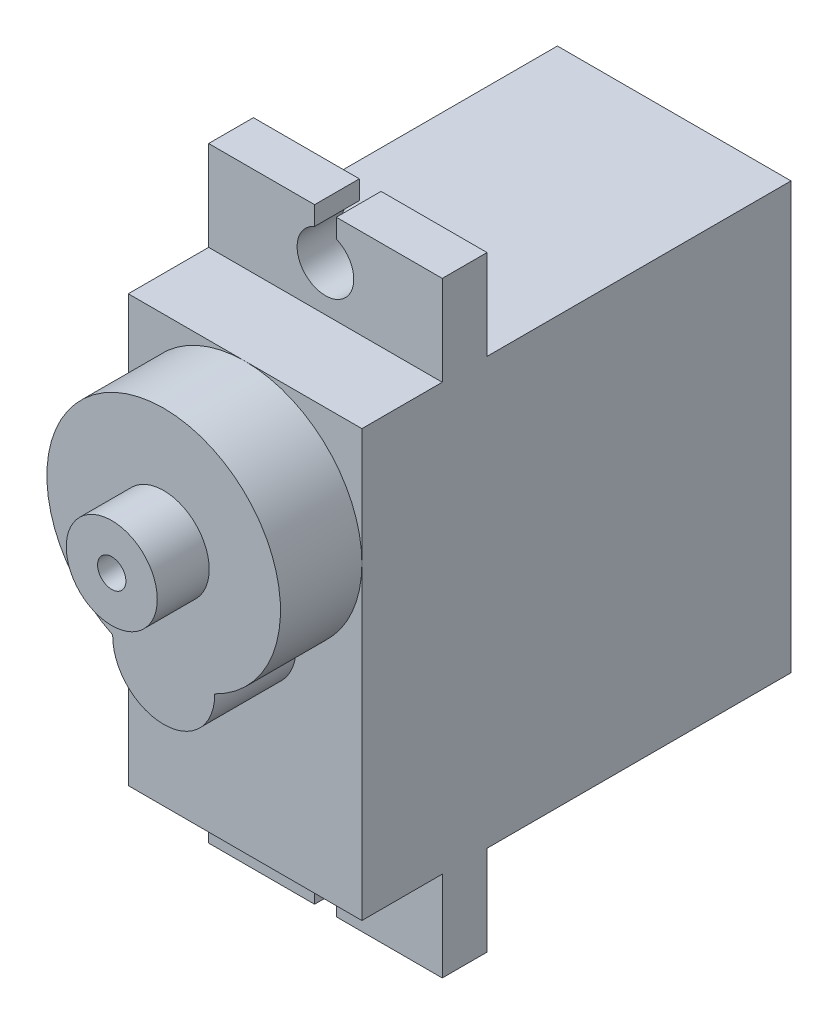
ISO-10303-21;
HEADER;
FILE_DESCRIPTION(('STEP AP214'),'2;1');
FILE_NAME('part.step','',(''),(''),'','','');
FILE_SCHEMA(('AUTOMOTIVE_DESIGN { 1 0 10303 214 1 1 1 1 }'));
ENDSEC;
DATA;
#1=APPLICATION_CONTEXT('core data for automotive mechanical design processes');
#2=APPLICATION_PROTOCOL_DEFINITION('international standard','automotive_design',2000,#1);
#3=PRODUCT_CONTEXT('',#1,'mechanical');
#4=PRODUCT('Part','Part','',(#3));
#5=PRODUCT_RELATED_PRODUCT_CATEGORY('part','',(#4));
#6=PRODUCT_DEFINITION_FORMATION('','',#4);
#7=PRODUCT_DEFINITION_CONTEXT('part definition',#1,'design');
#8=PRODUCT_DEFINITION('design','',#6,#7);
#9=PRODUCT_DEFINITION_SHAPE('','',#8);
#10=(LENGTH_UNIT() NAMED_UNIT(*) SI_UNIT(.MILLI.,.METRE.));
#11=(NAMED_UNIT(*) PLANE_ANGLE_UNIT() SI_UNIT($,.RADIAN.));
#12=(NAMED_UNIT(*) SI_UNIT($,.STERADIAN.) SOLID_ANGLE_UNIT());
#13=UNCERTAINTY_MEASURE_WITH_UNIT(LENGTH_MEASURE(1.E-05),#10,'distance_accuracy_value','');
#14=(GEOMETRIC_REPRESENTATION_CONTEXT(3) GLOBAL_UNCERTAINTY_ASSIGNED_CONTEXT((#13)) GLOBAL_UNIT_ASSIGNED_CONTEXT((#10,
#11,#12)) REPRESENTATION_CONTEXT('',''));
#15=CARTESIAN_POINT('',(0.,0.,0.));
#16=DIRECTION('',(0.,0.,1.));
#17=DIRECTION('',(1.,0.,0.));
#18=AXIS2_PLACEMENT_3D('',#15,#16,#17);
#19=CARTESIAN_POINT('',(0.,0.,11.36015));
#20=DIRECTION('',(0.,0.,-1.));
#21=DIRECTION('',(-1.,0.,0.));
#22=AXIS2_PLACEMENT_3D('',#19,#20,#21);
#23=PLANE('',#22);
#24=CARTESIAN_POINT('',(0.,5.0927,11.36015));
#25=DIRECTION('',(0.,0.,1.));
#26=DIRECTION('',(1.,0.,0.));
#27=AXIS2_PLACEMENT_3D('',#24,#25,#26);
#28=CIRCLE('',#27,6.1849);
#29=CARTESIAN_POINT('',(2.7,-0.471739595323143,11.36015));
#30=VERTEX_POINT('',#29);
#31=CARTESIAN_POINT('',(6.1849,5.0927,11.36015));
#32=VERTEX_POINT('',#31);
#33=EDGE_CURVE('E59',#30,#32,#28,.T.);
#34=ORIENTED_EDGE('',*,*,#33,.F.);
#35=DIRECTION('',(0.,1.,0.));
#36=VECTOR('',#35,1.);
#37=CARTESIAN_POINT('',(2.7,-0.522399999999999,11.36015));
#38=LINE('',#37,#36);
#39=CARTESIAN_POINT('',(2.7,-0.522399999999999,11.36015));
#40=VERTEX_POINT('',#39);
#41=EDGE_CURVE('E64',#40,#30,#38,.T.);
#42=ORIENTED_EDGE('',*,*,#41,.F.);
#43=CARTESIAN_POINT('',(0.,-0.5224,11.36015));
#44=DIRECTION('',(0.,0.,1.));
#45=DIRECTION('',(-1.,0.,0.));
#46=AXIS2_PLACEMENT_3D('',#43,#44,#45);
#47=CIRCLE('',#46,2.7);
#48=CARTESIAN_POINT('',(-2.7,-0.5224,11.36015));
#49=VERTEX_POINT('',#48);
#50=EDGE_CURVE('E539',#49,#40,#47,.T.);
#51=ORIENTED_EDGE('',*,*,#50,.F.);
#52=DIRECTION('',(0.,-1.,0.));
#53=VECTOR('',#52,1.);
#54=CARTESIAN_POINT('',(-2.7,-0.5224,11.36015));
#55=LINE('',#54,#53);
#56=CARTESIAN_POINT('',(-2.7,-0.471739595323143,11.36015));
#57=VERTEX_POINT('',#56);
#58=EDGE_CURVE('E541',#57,#49,#55,.T.);
#59=ORIENTED_EDGE('',*,*,#58,.F.);
#60=CARTESIAN_POINT('',(-6.1849,5.0927,11.36015));
#61=VERTEX_POINT('',#60);
#62=EDGE_CURVE('E287',#61,#57,#28,.T.);
#63=ORIENTED_EDGE('',*,*,#62,.F.);
#64=DIRECTION('',(0.,-1.,0.));
#65=VECTOR('',#64,1.);
#66=CARTESIAN_POINT('',(-6.1849,-11.2776,11.36015));
#67=LINE('',#66,#65);
#68=CARTESIAN_POINT('',(-6.1849,-11.2776,11.36015));
#69=VERTEX_POINT('',#68);
#70=EDGE_CURVE('E462',#61,#69,#67,.T.);
#71=ORIENTED_EDGE('',*,*,#70,.T.);
#72=DIRECTION('',(1.,0.,0.));
#73=VECTOR('',#72,1.);
#74=CARTESIAN_POINT('',(-6.1849,-11.2776,11.36015));
#75=LINE('',#74,#73);
#76=CARTESIAN_POINT('',(6.1849,-11.2776,11.36015));
#77=VERTEX_POINT('',#76);
#78=EDGE_CURVE('E467',#69,#77,#75,.T.);
#79=ORIENTED_EDGE('',*,*,#78,.T.);
#80=DIRECTION('',(0.,1.,0.));
#81=VECTOR('',#80,1.);
#82=CARTESIAN_POINT('',(6.1849,-11.2776,11.36015));
#83=LINE('',#82,#81);
#84=EDGE_CURVE('E453',#77,#32,#83,.T.);
#85=ORIENTED_EDGE('',*,*,#84,.T.);
#86=EDGE_LOOP('',(#34,#42,#51,#59,#63,#71,#79,#85));
#87=FACE_BOUND('',#86,.T.);
#88=ADVANCED_FACE('F40',(#87),#23,.F.);
#89=CARTESIAN_POINT('',(0.,11.2776,11.36015));
#90=VERTEX_POINT('',#89);
#91=EDGE_CURVE('E49',#32,#90,#28,.T.);
#92=ORIENTED_EDGE('',*,*,#91,.F.);
#93=CARTESIAN_POINT('',(6.1849,11.2776,11.36015));
#94=VERTEX_POINT('',#93);
#95=EDGE_CURVE('E457',#32,#94,#83,.T.);
#96=ORIENTED_EDGE('',*,*,#95,.T.);
#97=DIRECTION('',(-1.,0.,0.));
#98=VECTOR('',#97,1.);
#99=CARTESIAN_POINT('',(-6.1849,11.2776,11.36015));
#100=LINE('',#99,#98);
#101=EDGE_CURVE('E458',#94,#90,#100,.T.);
#102=ORIENTED_EDGE('',*,*,#101,.T.);
#103=EDGE_LOOP('',(#92,#96,#102));
#104=FACE_BOUND('',#103,.T.);
#105=ADVANCED_FACE('F585',(#104),#23,.F.);
#106=EDGE_CURVE('E507',#90,#61,#28,.T.);
#107=ORIENTED_EDGE('',*,*,#106,.F.);
#108=CARTESIAN_POINT('',(-6.1849,11.2776,11.36015));
#109=VERTEX_POINT('',#108);
#110=EDGE_CURVE('E456',#90,#109,#100,.T.);
#111=ORIENTED_EDGE('',*,*,#110,.T.);
#112=EDGE_CURVE('E463',#109,#61,#67,.T.);
#113=ORIENTED_EDGE('',*,*,#112,.T.);
#114=EDGE_LOOP('',(#107,#111,#113));
#115=FACE_BOUND('',#114,.T.);
#116=ADVANCED_FACE('F587',(#115),#23,.F.);
#117=CARTESIAN_POINT('',(-6.1849,-11.2776,11.36015));
#118=DIRECTION('',(0.,1.,0.));
#119=DIRECTION('',(0.,0.,1.));
#120=AXIS2_PLACEMENT_3D('',#117,#118,#119);
#121=PLANE('',#120);
#122=DIRECTION('',(1.,0.,0.));
#123=VECTOR('',#122,1.);
#124=CARTESIAN_POINT('',(-6.1849,-11.2776,4.73565));
#125=LINE('',#124,#123);
#126=CARTESIAN_POINT('',(-6.1849,-11.2776,4.73565));
#127=VERTEX_POINT('',#126);
#128=CARTESIAN_POINT('',(6.1849,-11.2776,4.73565));
#129=VERTEX_POINT('',#128);
#130=EDGE_CURVE('E324',#127,#129,#125,.T.);
#131=ORIENTED_EDGE('',*,*,#130,.F.);
#132=DIRECTION('',(0.,0.,-1.));
#133=VECTOR('',#132,1.);
#134=CARTESIAN_POINT('',(-6.1849,-11.2776,11.36015));
#135=LINE('',#134,#133);
#136=CARTESIAN_POINT('',(-6.1849,-11.2776,-11.36015));
#137=VERTEX_POINT('',#136);
#138=EDGE_CURVE('E490',#127,#137,#135,.T.);
#139=ORIENTED_EDGE('',*,*,#138,.T.);
#140=DIRECTION('',(1.,0.,0.));
#141=VECTOR('',#140,1.);
#142=CARTESIAN_POINT('',(-6.1849,-11.2776,-11.36015));
#143=LINE('',#142,#141);
#144=CARTESIAN_POINT('',(6.1849,-11.2776,-11.36015));
#145=VERTEX_POINT('',#144);
#146=EDGE_CURVE('E482',#137,#145,#143,.T.);
#147=ORIENTED_EDGE('',*,*,#146,.T.);
#148=DIRECTION('',(0.,0.,-1.));
#149=VECTOR('',#148,1.);
#150=CARTESIAN_POINT('',(6.1849,-11.2776,11.36015));
#151=LINE('',#150,#149);
#152=EDGE_CURVE('E470',#129,#145,#151,.T.);
#153=ORIENTED_EDGE('',*,*,#152,.F.);
#154=EDGE_LOOP('',(#131,#139,#147,#153));
#155=FACE_BOUND('',#154,.T.);
#156=ADVANCED_FACE('F525',(#155),#121,.F.);
#157=CARTESIAN_POINT('',(-6.1849,11.2776,11.36015));
#158=DIRECTION('',(0.,-1.,0.));
#159=DIRECTION('',(0.,0.,-1.));
#160=AXIS2_PLACEMENT_3D('',#157,#158,#159);
#161=PLANE('',#160);
#162=DIRECTION('',(1.,0.,0.));
#163=VECTOR('',#162,1.);
#164=CARTESIAN_POINT('',(-6.1849,11.2776,7.10565));
#165=LINE('',#164,#163);
#166=CARTESIAN_POINT('',(-6.1849,11.2776,7.10565));
#167=VERTEX_POINT('',#166);
#168=CARTESIAN_POINT('',(6.1849,11.2776,7.10565));
#169=VERTEX_POINT('',#168);
#170=EDGE_CURVE('E408',#167,#169,#165,.T.);
#171=ORIENTED_EDGE('',*,*,#170,.F.);
#172=DIRECTION('',(0.,0.,-1.));
#173=VECTOR('',#172,1.);
#174=CARTESIAN_POINT('',(-6.1849,11.2776,11.36015));
#175=LINE('',#174,#173);
#176=EDGE_CURVE('E495',#109,#167,#175,.T.);
#177=ORIENTED_EDGE('',*,*,#176,.F.);
#178=ORIENTED_EDGE('',*,*,#110,.F.);
#179=ORIENTED_EDGE('',*,*,#101,.F.);
#180=DIRECTION('',(0.,0.,-1.));
#181=VECTOR('',#180,1.);
#182=CARTESIAN_POINT('',(6.1849,11.2776,11.36015));
#183=LINE('',#182,#181);
#184=EDGE_CURVE('E499',#94,#169,#183,.T.);
#185=ORIENTED_EDGE('',*,*,#184,.T.);
#186=EDGE_LOOP('',(#171,#177,#178,#179,#185));
#187=FACE_BOUND('',#186,.T.);
#188=ADVANCED_FACE('F599',(#187),#161,.F.);
#189=CARTESIAN_POINT('',(6.1849,-11.2776,11.36015));
#190=DIRECTION('',(-1.,0.,0.));
#191=DIRECTION('',(0.,0.,1.));
#192=AXIS2_PLACEMENT_3D('',#189,#190,#191);
#193=PLANE('',#192);
#194=DIRECTION('',(0.,1.,0.));
#195=VECTOR('',#194,1.);
#196=CARTESIAN_POINT('',(6.1849,-11.2776,-11.36015));
#197=LINE('',#196,#195);
#198=CARTESIAN_POINT('',(6.1849,11.2776,-11.36015));
#199=VERTEX_POINT('',#198);
#200=EDGE_CURVE('E438',#145,#199,#197,.T.);
#201=ORIENTED_EDGE('',*,*,#200,.T.);
#202=CARTESIAN_POINT('',(6.1849,11.2776,4.73565));
#203=VERTEX_POINT('',#202);
#204=EDGE_CURVE('E498',#203,#199,#183,.T.);
#205=ORIENTED_EDGE('',*,*,#204,.F.);
#206=DIRECTION('',(0.,1.,0.));
#207=VECTOR('',#206,1.);
#208=CARTESIAN_POINT('',(6.1849,11.2776,4.73565));
#209=LINE('',#208,#207);
#210=CARTESIAN_POINT('',(6.1849,16.0401,4.73565));
#211=VERTEX_POINT('',#210);
#212=EDGE_CURVE('E381',#203,#211,#209,.T.);
#213=ORIENTED_EDGE('',*,*,#212,.T.);
#214=DIRECTION('',(0.,0.,1.));
#215=VECTOR('',#214,1.);
#216=CARTESIAN_POINT('',(6.1849,16.0401,4.73565));
#217=LINE('',#216,#215);
#218=CARTESIAN_POINT('',(6.1849,16.0401,7.10565));
#219=VERTEX_POINT('',#218);
#220=EDGE_CURVE('E405',#211,#219,#217,.T.);
#221=ORIENTED_EDGE('',*,*,#220,.T.);
#222=DIRECTION('',(0.,1.,0.));
#223=VECTOR('',#222,1.);
#224=CARTESIAN_POINT('',(6.1849,11.2776,7.10565));
#225=LINE('',#224,#223);
#226=EDGE_CURVE('E412',#169,#219,#225,.T.);
#227=ORIENTED_EDGE('',*,*,#226,.F.);
#228=ORIENTED_EDGE('',*,*,#184,.F.);
#229=ORIENTED_EDGE('',*,*,#95,.F.);
#230=ORIENTED_EDGE('',*,*,#84,.F.);
#231=CARTESIAN_POINT('',(6.1849,-11.2776,7.10565));
#232=VERTEX_POINT('',#231);
#233=EDGE_CURVE('E486',#77,#232,#151,.T.);
#234=ORIENTED_EDGE('',*,*,#233,.T.);
#235=DIRECTION('',(0.,-1.,0.));
#236=VECTOR('',#235,1.);
#237=CARTESIAN_POINT('',(6.1849,-11.2776,7.10565));
#238=LINE('',#237,#236);
#239=CARTESIAN_POINT('',(6.1849,-16.0401,7.10565));
#240=VERTEX_POINT('',#239);
#241=EDGE_CURVE('E343',#232,#240,#238,.T.);
#242=ORIENTED_EDGE('',*,*,#241,.T.);
#243=DIRECTION('',(0.,0.,1.));
#244=VECTOR('',#243,1.);
#245=CARTESIAN_POINT('',(6.1849,-16.0401,4.73565));
#246=LINE('',#245,#244);
#247=CARTESIAN_POINT('',(6.1849,-16.0401,4.73565));
#248=VERTEX_POINT('',#247);
#249=EDGE_CURVE('E348',#248,#240,#246,.T.);
#250=ORIENTED_EDGE('',*,*,#249,.F.);
#251=DIRECTION('',(0.,-1.,0.));
#252=VECTOR('',#251,1.);
#253=CARTESIAN_POINT('',(6.1849,-11.2776,4.73565));
#254=LINE('',#253,#252);
#255=EDGE_CURVE('E321',#129,#248,#254,.T.);
#256=ORIENTED_EDGE('',*,*,#255,.F.);
#257=ORIENTED_EDGE('',*,*,#152,.T.);
#258=EDGE_LOOP('',(#201,#205,#213,#221,#227,#228,#229,#230,#234,#242,#250,#256,#257));
#259=FACE_BOUND('',#258,.T.);
#260=ADVANCED_FACE('F42',(#259),#193,.F.);
#261=CARTESIAN_POINT('',(-6.1849,11.2776,4.73565));
#262=VERTEX_POINT('',#261);
#263=CARTESIAN_POINT('',(-6.1849,11.2776,-11.36015));
#264=VERTEX_POINT('',#263);
#265=EDGE_CURVE('E494',#262,#264,#175,.T.);
#266=ORIENTED_EDGE('',*,*,#265,.F.);
#267=DIRECTION('',(1.,0.,0.));
#268=VECTOR('',#267,1.);
#269=CARTESIAN_POINT('',(-6.1849,11.2776,4.73565));
#270=LINE('',#269,#268);
#271=EDGE_CURVE('E376',#262,#203,#270,.T.);
#272=ORIENTED_EDGE('',*,*,#271,.T.);
#273=ORIENTED_EDGE('',*,*,#204,.T.);
#274=DIRECTION('',(-1.,0.,0.));
#275=VECTOR('',#274,1.);
#276=CARTESIAN_POINT('',(-6.1849,11.2776,-11.36015));
#277=LINE('',#276,#275);
#278=EDGE_CURVE('E474',#199,#264,#277,.T.);
#279=ORIENTED_EDGE('',*,*,#278,.T.);
#280=EDGE_LOOP('',(#266,#272,#273,#279));
#281=FACE_BOUND('',#280,.T.);
#282=ADVANCED_FACE('F514',(#281),#161,.F.);
#283=CARTESIAN_POINT('',(-6.1849,-11.2776,11.36015));
#284=DIRECTION('',(1.,0.,0.));
#285=DIRECTION('',(0.,0.,-1.));
#286=AXIS2_PLACEMENT_3D('',#283,#284,#285);
#287=PLANE('',#286);
#288=DIRECTION('',(0.,-1.,0.));
#289=VECTOR('',#288,1.);
#290=CARTESIAN_POINT('',(-6.1849,-11.2776,-11.36015));
#291=LINE('',#290,#289);
#292=EDGE_CURVE('E478',#264,#137,#291,.T.);
#293=ORIENTED_EDGE('',*,*,#292,.T.);
#294=ORIENTED_EDGE('',*,*,#138,.F.);
#295=DIRECTION('',(0.,1.,0.));
#296=VECTOR('',#295,1.);
#297=CARTESIAN_POINT('',(-6.1849,-16.0401,4.73565));
#298=LINE('',#297,#296);
#299=CARTESIAN_POINT('',(-6.1849,-16.0401,4.73565));
#300=VERTEX_POINT('',#299);
#301=EDGE_CURVE('E301',#300,#127,#298,.T.);
#302=ORIENTED_EDGE('',*,*,#301,.F.);
#303=DIRECTION('',(0.,0.,1.));
#304=VECTOR('',#303,1.);
#305=CARTESIAN_POINT('',(-6.1849,-16.0401,4.73565));
#306=LINE('',#305,#304);
#307=CARTESIAN_POINT('',(-6.1849,-16.0401,7.10565));
#308=VERTEX_POINT('',#307);
#309=EDGE_CURVE('E327',#300,#308,#306,.T.);
#310=ORIENTED_EDGE('',*,*,#309,.T.);
#311=DIRECTION('',(0.,1.,0.));
#312=VECTOR('',#311,1.);
#313=CARTESIAN_POINT('',(-6.1849,-16.0401,7.10565));
#314=LINE('',#313,#312);
#315=CARTESIAN_POINT('',(-6.1849,-11.2776,7.10565));
#316=VERTEX_POINT('',#315);
#317=EDGE_CURVE('E289',#308,#316,#314,.T.);
#318=ORIENTED_EDGE('',*,*,#317,.T.);
#319=EDGE_CURVE('E491',#69,#316,#135,.T.);
#320=ORIENTED_EDGE('',*,*,#319,.F.);
#321=ORIENTED_EDGE('',*,*,#70,.F.);
#322=ORIENTED_EDGE('',*,*,#112,.F.);
#323=ORIENTED_EDGE('',*,*,#176,.T.);
#324=DIRECTION('',(0.,-1.,0.));
#325=VECTOR('',#324,1.);
#326=CARTESIAN_POINT('',(-6.1849,16.0401,7.10565));
#327=LINE('',#326,#325);
#328=CARTESIAN_POINT('',(-6.1849,16.0401,7.10565));
#329=VERTEX_POINT('',#328);
#330=EDGE_CURVE('E352',#329,#167,#327,.T.);
#331=ORIENTED_EDGE('',*,*,#330,.F.);
#332=DIRECTION('',(0.,0.,1.));
#333=VECTOR('',#332,1.);
#334=CARTESIAN_POINT('',(-6.1849,16.0401,4.73565));
#335=LINE('',#334,#333);
#336=CARTESIAN_POINT('',(-6.1849,16.0401,4.73565));
#337=VERTEX_POINT('',#336);
#338=EDGE_CURVE('E435',#337,#329,#335,.T.);
#339=ORIENTED_EDGE('',*,*,#338,.F.);
#340=DIRECTION('',(0.,-1.,0.));
#341=VECTOR('',#340,1.);
#342=CARTESIAN_POINT('',(-6.1849,16.0401,4.73565));
#343=LINE('',#342,#341);
#344=EDGE_CURVE('E372',#337,#262,#343,.T.);
#345=ORIENTED_EDGE('',*,*,#344,.T.);
#346=ORIENTED_EDGE('',*,*,#265,.T.);
#347=EDGE_LOOP('',(#293,#294,#302,#310,#318,#320,#321,#322,#323,#331,#339,#345,#346));
#348=FACE_BOUND('',#347,.T.);
#349=ADVANCED_FACE('F530',(#348),#287,.F.);
#350=ORIENTED_EDGE('',*,*,#319,.T.);
#351=DIRECTION('',(1.,0.,0.));
#352=VECTOR('',#351,1.);
#353=CARTESIAN_POINT('',(-6.1849,-11.2776,7.10565));
#354=LINE('',#353,#352);
#355=EDGE_CURVE('E306',#316,#232,#354,.T.);
#356=ORIENTED_EDGE('',*,*,#355,.T.);
#357=ORIENTED_EDGE('',*,*,#233,.F.);
#358=ORIENTED_EDGE('',*,*,#78,.F.);
#359=EDGE_LOOP('',(#350,#356,#357,#358));
#360=FACE_BOUND('',#359,.T.);
#361=ADVANCED_FACE('F601',(#360),#121,.F.);
#362=CARTESIAN_POINT('',(0.,0.,-11.36015));
#363=DIRECTION('',(0.,0.,-1.));
#364=DIRECTION('',(-1.,0.,0.));
#365=AXIS2_PLACEMENT_3D('',#362,#363,#364);
#366=PLANE('',#365);
#367=ORIENTED_EDGE('',*,*,#200,.F.);
#368=ORIENTED_EDGE('',*,*,#146,.F.);
#369=ORIENTED_EDGE('',*,*,#292,.F.);
#370=ORIENTED_EDGE('',*,*,#278,.F.);
#371=EDGE_LOOP('',(#367,#368,#369,#370));
#372=FACE_BOUND('',#371,.T.);
#373=ADVANCED_FACE('F519',(#372),#366,.T.);
#374=CARTESIAN_POINT('',(-0.575,16.0401,4.73565));
#375=DIRECTION('',(0.,1.,0.));
#376=DIRECTION('',(0.,0.,1.));
#377=AXIS2_PLACEMENT_3D('',#374,#375,#376);
#378=PLANE('',#377);
#379=DIRECTION('',(-1.,0.,0.));
#380=VECTOR('',#379,1.);
#381=CARTESIAN_POINT('',(-0.575,16.0401,7.10565));
#382=LINE('',#381,#380);
#383=CARTESIAN_POINT('',(-0.575,16.0401,7.10565));
#384=VERTEX_POINT('',#383);
#385=EDGE_CURVE('E377',#384,#329,#382,.T.);
#386=ORIENTED_EDGE('',*,*,#385,.F.);
#387=DIRECTION('',(0.,0.,1.));
#388=VECTOR('',#387,1.);
#389=CARTESIAN_POINT('',(-0.575,16.0401,4.73565));
#390=LINE('',#389,#388);
#391=CARTESIAN_POINT('',(-0.575,16.0401,4.73565));
#392=VERTEX_POINT('',#391);
#393=EDGE_CURVE('E439',#392,#384,#390,.T.);
#394=ORIENTED_EDGE('',*,*,#393,.F.);
#395=DIRECTION('',(-1.,0.,0.));
#396=VECTOR('',#395,1.);
#397=CARTESIAN_POINT('',(-0.575,16.0401,4.73565));
#398=LINE('',#397,#396);
#399=EDGE_CURVE('E401',#392,#337,#398,.T.);
#400=ORIENTED_EDGE('',*,*,#399,.T.);
#401=ORIENTED_EDGE('',*,*,#338,.T.);
#402=EDGE_LOOP('',(#386,#394,#400,#401));
#403=FACE_BOUND('',#402,.T.);
#404=ADVANCED_FACE('F628',(#403),#378,.T.);
#405=CARTESIAN_POINT('',(-0.575,15.0401,4.73565));
#406=DIRECTION('',(1.,0.,0.));
#407=DIRECTION('',(0.,1.,0.));
#408=AXIS2_PLACEMENT_3D('',#405,#406,#407);
#409=PLANE('',#408);
#410=DIRECTION('',(0.,1.,0.));
#411=VECTOR('',#410,1.);
#412=CARTESIAN_POINT('',(-0.575,15.0401,7.10565));
#413=LINE('',#412,#411);
#414=CARTESIAN_POINT('',(-0.575,15.0401,7.10565));
#415=VERTEX_POINT('',#414);
#416=EDGE_CURVE('E428',#415,#384,#413,.T.);
#417=ORIENTED_EDGE('',*,*,#416,.F.);
#418=DIRECTION('',(0.,0.,1.));
#419=VECTOR('',#418,1.);
#420=CARTESIAN_POINT('',(-0.575,15.0401,4.73565));
#421=LINE('',#420,#419);
#422=CARTESIAN_POINT('',(-0.575,15.0401,4.73565));
#423=VERTEX_POINT('',#422);
#424=EDGE_CURVE('E442',#423,#415,#421,.T.);
#425=ORIENTED_EDGE('',*,*,#424,.F.);
#426=DIRECTION('',(0.,1.,0.));
#427=VECTOR('',#426,1.);
#428=CARTESIAN_POINT('',(-0.575,15.0401,4.73565));
#429=LINE('',#428,#427);
#430=EDGE_CURVE('E397',#423,#392,#429,.T.);
#431=ORIENTED_EDGE('',*,*,#430,.T.);
#432=ORIENTED_EDGE('',*,*,#393,.T.);
#433=EDGE_LOOP('',(#417,#425,#431,#432));
#434=FACE_BOUND('',#433,.T.);
#435=ADVANCED_FACE('F645',(#434),#409,.T.);
#436=CARTESIAN_POINT('',(0.,13.6546848997503,4.73565));
#437=DIRECTION('',(0.,0.,1.));
#438=DIRECTION('',(1.,0.,0.));
#439=AXIS2_PLACEMENT_3D('',#436,#437,#438);
#440=CYLINDRICAL_SURFACE('',#439,1.5);
#441=CARTESIAN_POINT('',(0.,13.6546848997503,7.10565));
#442=DIRECTION('',(0.,0.,-1.));
#443=DIRECTION('',(-1.,0.,0.));
#444=AXIS2_PLACEMENT_3D('',#441,#442,#443);
#445=CIRCLE('',#444,1.5);
#446=CARTESIAN_POINT('',(0.575,15.0401,7.10565));
#447=VERTEX_POINT('',#446);
#448=EDGE_CURVE('E424',#447,#415,#445,.T.);
#449=ORIENTED_EDGE('',*,*,#448,.F.);
#450=DIRECTION('',(0.,0.,1.));
#451=VECTOR('',#450,1.);
#452=CARTESIAN_POINT('',(0.575,15.0401,4.73565));
#453=LINE('',#452,#451);
#454=CARTESIAN_POINT('',(0.575,15.0401,4.73565));
#455=VERTEX_POINT('',#454);
#456=EDGE_CURVE('E445',#455,#447,#453,.T.);
#457=ORIENTED_EDGE('',*,*,#456,.F.);
#458=CARTESIAN_POINT('',(0.,13.6546848997503,4.73565));
#459=DIRECTION('',(0.,0.,-1.));
#460=DIRECTION('',(-1.,0.,0.));
#461=AXIS2_PLACEMENT_3D('',#458,#459,#460);
#462=CIRCLE('',#461,1.5);
#463=EDGE_CURVE('E393',#455,#423,#462,.T.);
#464=ORIENTED_EDGE('',*,*,#463,.T.);
#465=ORIENTED_EDGE('',*,*,#424,.T.);
#466=EDGE_LOOP('',(#449,#457,#464,#465));
#467=FACE_BOUND('',#466,.T.);
#468=ADVANCED_FACE('F643',(#467),#440,.F.);
#469=CARTESIAN_POINT('',(0.575,16.0401,4.73565));
#470=DIRECTION('',(-1.,0.,0.));
#471=DIRECTION('',(0.,-1.,0.));
#472=AXIS2_PLACEMENT_3D('',#469,#470,#471);
#473=PLANE('',#472);
#474=DIRECTION('',(0.,-1.,0.));
#475=VECTOR('',#474,1.);
#476=CARTESIAN_POINT('',(0.575,16.0401,7.10565));
#477=LINE('',#476,#475);
#478=CARTESIAN_POINT('',(0.575,16.0401,7.10565));
#479=VERTEX_POINT('',#478);
#480=EDGE_CURVE('E420',#479,#447,#477,.T.);
#481=ORIENTED_EDGE('',*,*,#480,.F.);
#482=DIRECTION('',(0.,0.,1.));
#483=VECTOR('',#482,1.);
#484=CARTESIAN_POINT('',(0.575,16.0401,4.73565));
#485=LINE('',#484,#483);
#486=CARTESIAN_POINT('',(0.575,16.0401,4.73565));
#487=VERTEX_POINT('',#486);
#488=EDGE_CURVE('E448',#487,#479,#485,.T.);
#489=ORIENTED_EDGE('',*,*,#488,.F.);
#490=DIRECTION('',(0.,-1.,0.));
#491=VECTOR('',#490,1.);
#492=CARTESIAN_POINT('',(0.575,16.0401,4.73565));
#493=LINE('',#492,#491);
#494=EDGE_CURVE('E389',#487,#455,#493,.T.);
#495=ORIENTED_EDGE('',*,*,#494,.T.);
#496=ORIENTED_EDGE('',*,*,#456,.T.);
#497=EDGE_LOOP('',(#481,#489,#495,#496));
#498=FACE_BOUND('',#497,.T.);
#499=ADVANCED_FACE('F641',(#498),#473,.T.);
#500=CARTESIAN_POINT('',(6.1849,16.0401,4.73565));
#501=DIRECTION('',(0.,1.,0.));
#502=DIRECTION('',(0.,0.,1.));
#503=AXIS2_PLACEMENT_3D('',#500,#501,#502);
#504=PLANE('',#503);
#505=DIRECTION('',(-1.,0.,0.));
#506=VECTOR('',#505,1.);
#507=CARTESIAN_POINT('',(6.1849,16.0401,7.10565));
#508=LINE('',#507,#506);
#509=EDGE_CURVE('E416',#219,#479,#508,.T.);
#510=ORIENTED_EDGE('',*,*,#509,.F.);
#511=ORIENTED_EDGE('',*,*,#220,.F.);
#512=DIRECTION('',(-1.,0.,0.));
#513=VECTOR('',#512,1.);
#514=CARTESIAN_POINT('',(6.1849,16.0401,4.73565));
#515=LINE('',#514,#513);
#516=EDGE_CURVE('E385',#211,#487,#515,.T.);
#517=ORIENTED_EDGE('',*,*,#516,.T.);
#518=ORIENTED_EDGE('',*,*,#488,.T.);
#519=EDGE_LOOP('',(#510,#511,#517,#518));
#520=FACE_BOUND('',#519,.T.);
#521=ADVANCED_FACE('F637',(#520),#504,.T.);
#522=CARTESIAN_POINT('',(0.,13.6546848997503,4.73565));
#523=DIRECTION('',(0.,0.,-1.));
#524=DIRECTION('',(-1.,0.,0.));
#525=AXIS2_PLACEMENT_3D('',#522,#523,#524);
#526=PLANE('',#525);
#527=ORIENTED_EDGE('',*,*,#344,.F.);
#528=ORIENTED_EDGE('',*,*,#399,.F.);
#529=ORIENTED_EDGE('',*,*,#430,.F.);
#530=ORIENTED_EDGE('',*,*,#463,.F.);
#531=ORIENTED_EDGE('',*,*,#494,.F.);
#532=ORIENTED_EDGE('',*,*,#516,.F.);
#533=ORIENTED_EDGE('',*,*,#212,.F.);
#534=ORIENTED_EDGE('',*,*,#271,.F.);
#535=EDGE_LOOP('',(#527,#528,#529,#530,#531,#532,#533,#534));
#536=FACE_BOUND('',#535,.T.);
#537=ADVANCED_FACE('F632',(#536),#526,.T.);
#538=CARTESIAN_POINT('',(0.,13.6546848997503,7.10565));
#539=DIRECTION('',(0.,0.,-1.));
#540=DIRECTION('',(-1.,0.,0.));
#541=AXIS2_PLACEMENT_3D('',#538,#539,#540);
#542=PLANE('',#541);
#543=ORIENTED_EDGE('',*,*,#330,.T.);
#544=ORIENTED_EDGE('',*,*,#170,.T.);
#545=ORIENTED_EDGE('',*,*,#226,.T.);
#546=ORIENTED_EDGE('',*,*,#509,.T.);
#547=ORIENTED_EDGE('',*,*,#480,.T.);
#548=ORIENTED_EDGE('',*,*,#448,.T.);
#549=ORIENTED_EDGE('',*,*,#416,.T.);
#550=ORIENTED_EDGE('',*,*,#385,.T.);
#551=EDGE_LOOP('',(#543,#544,#545,#546,#547,#548,#549,#550));
#552=FACE_BOUND('',#551,.T.);
#553=ADVANCED_FACE('F623',(#552),#542,.F.);
#554=CARTESIAN_POINT('',(6.1849,-16.0401,4.73565));
#555=DIRECTION('',(0.,1.,0.));
#556=DIRECTION('',(0.,0.,1.));
#557=AXIS2_PLACEMENT_3D('',#554,#555,#556);
#558=PLANE('',#557);
#559=DIRECTION('',(-1.,0.,0.));
#560=VECTOR('',#559,1.);
#561=CARTESIAN_POINT('',(6.1849,-16.0401,7.10565));
#562=LINE('',#561,#560);
#563=CARTESIAN_POINT('',(0.575,-16.0401,7.10565));
#564=VERTEX_POINT('',#563);
#565=EDGE_CURVE('E340',#240,#564,#562,.T.);
#566=ORIENTED_EDGE('',*,*,#565,.T.);
#567=DIRECTION('',(0.,0.,1.));
#568=VECTOR('',#567,1.);
#569=CARTESIAN_POINT('',(0.575,-16.0401,4.73565));
#570=LINE('',#569,#568);
#571=CARTESIAN_POINT('',(0.575,-16.0401,4.73565));
#572=VERTEX_POINT('',#571);
#573=EDGE_CURVE('E353',#572,#564,#570,.T.);
#574=ORIENTED_EDGE('',*,*,#573,.F.);
#575=DIRECTION('',(-1.,0.,0.));
#576=VECTOR('',#575,1.);
#577=CARTESIAN_POINT('',(6.1849,-16.0401,4.73565));
#578=LINE('',#577,#576);
#579=EDGE_CURVE('E318',#248,#572,#578,.T.);
#580=ORIENTED_EDGE('',*,*,#579,.F.);
#581=ORIENTED_EDGE('',*,*,#249,.T.);
#582=EDGE_LOOP('',(#566,#574,#580,#581));
#583=FACE_BOUND('',#582,.T.);
#584=ADVANCED_FACE('F665',(#583),#558,.F.);
#585=CARTESIAN_POINT('',(0.575,-16.0401,4.73565));
#586=DIRECTION('',(1.,0.,0.));
#587=DIRECTION('',(0.,1.,0.));
#588=AXIS2_PLACEMENT_3D('',#585,#586,#587);
#589=PLANE('',#588);
#590=DIRECTION('',(0.,1.,0.));
#591=VECTOR('',#590,1.);
#592=CARTESIAN_POINT('',(0.575,-16.0401,7.10565));
#593=LINE('',#592,#591);
#594=CARTESIAN_POINT('',(0.575,-15.0401,7.10565));
#595=VERTEX_POINT('',#594);
#596=EDGE_CURVE('E337',#564,#595,#593,.T.);
#597=ORIENTED_EDGE('',*,*,#596,.T.);
#598=DIRECTION('',(0.,0.,1.));
#599=VECTOR('',#598,1.);
#600=CARTESIAN_POINT('',(0.575,-15.0401,4.73565));
#601=LINE('',#600,#599);
#602=CARTESIAN_POINT('',(0.575,-15.0401,4.73565));
#603=VERTEX_POINT('',#602);
#604=EDGE_CURVE('E357',#603,#595,#601,.T.);
#605=ORIENTED_EDGE('',*,*,#604,.F.);
#606=DIRECTION('',(0.,1.,0.));
#607=VECTOR('',#606,1.);
#608=CARTESIAN_POINT('',(0.575,-16.0401,4.73565));
#609=LINE('',#608,#607);
#610=EDGE_CURVE('E315',#572,#603,#609,.T.);
#611=ORIENTED_EDGE('',*,*,#610,.F.);
#612=ORIENTED_EDGE('',*,*,#573,.T.);
#613=EDGE_LOOP('',(#597,#605,#611,#612));
#614=FACE_BOUND('',#613,.T.);
#615=ADVANCED_FACE('F679',(#614),#589,.F.);
#616=CARTESIAN_POINT('',(0.,-13.6546848997503,4.73565));
#617=DIRECTION('',(0.,0.,1.));
#618=DIRECTION('',(1.,0.,0.));
#619=AXIS2_PLACEMENT_3D('',#616,#617,#618);
#620=CYLINDRICAL_SURFACE('',#619,1.5);
#621=CARTESIAN_POINT('',(0.,-13.6546848997503,7.10565));
#622=DIRECTION('',(0.,0.,1.));
#623=DIRECTION('',(-1.,0.,0.));
#624=AXIS2_PLACEMENT_3D('',#621,#622,#623);
#625=CIRCLE('',#624,1.5);
#626=CARTESIAN_POINT('',(-0.575,-15.0401,7.10565));
#627=VERTEX_POINT('',#626);
#628=EDGE_CURVE('E334',#595,#627,#625,.T.);
#629=ORIENTED_EDGE('',*,*,#628,.T.);
#630=DIRECTION('',(0.,0.,1.));
#631=VECTOR('',#630,1.);
#632=CARTESIAN_POINT('',(-0.575,-15.0401,4.73565));
#633=LINE('',#632,#631);
#634=CARTESIAN_POINT('',(-0.575,-15.0401,4.73565));
#635=VERTEX_POINT('',#634);
#636=EDGE_CURVE('E361',#635,#627,#633,.T.);
#637=ORIENTED_EDGE('',*,*,#636,.F.);
#638=CARTESIAN_POINT('',(0.,-13.6546848997503,4.73565));
#639=DIRECTION('',(0.,0.,1.));
#640=DIRECTION('',(-1.,0.,0.));
#641=AXIS2_PLACEMENT_3D('',#638,#639,#640);
#642=CIRCLE('',#641,1.5);
#643=EDGE_CURVE('E312',#603,#635,#642,.T.);
#644=ORIENTED_EDGE('',*,*,#643,.F.);
#645=ORIENTED_EDGE('',*,*,#604,.T.);
#646=EDGE_LOOP('',(#629,#637,#644,#645));
#647=FACE_BOUND('',#646,.T.);
#648=ADVANCED_FACE('F675',(#647),#620,.F.);
#649=CARTESIAN_POINT('',(-0.575,-15.0401,4.73565));
#650=DIRECTION('',(-1.,0.,0.));
#651=DIRECTION('',(0.,-1.,0.));
#652=AXIS2_PLACEMENT_3D('',#649,#650,#651);
#653=PLANE('',#652);
#654=DIRECTION('',(0.,-1.,0.));
#655=VECTOR('',#654,1.);
#656=CARTESIAN_POINT('',(-0.575,-15.0401,7.10565));
#657=LINE('',#656,#655);
#658=CARTESIAN_POINT('',(-0.575,-16.0401,7.10565));
#659=VERTEX_POINT('',#658);
#660=EDGE_CURVE('E331',#627,#659,#657,.T.);
#661=ORIENTED_EDGE('',*,*,#660,.T.);
#662=DIRECTION('',(0.,0.,1.));
#663=VECTOR('',#662,1.);
#664=CARTESIAN_POINT('',(-0.575,-16.0401,4.73565));
#665=LINE('',#664,#663);
#666=CARTESIAN_POINT('',(-0.575,-16.0401,4.73565));
#667=VERTEX_POINT('',#666);
#668=EDGE_CURVE('E365',#667,#659,#665,.T.);
#669=ORIENTED_EDGE('',*,*,#668,.F.);
#670=DIRECTION('',(0.,-1.,0.));
#671=VECTOR('',#670,1.);
#672=CARTESIAN_POINT('',(-0.575,-15.0401,4.73565));
#673=LINE('',#672,#671);
#674=EDGE_CURVE('E309',#635,#667,#673,.T.);
#675=ORIENTED_EDGE('',*,*,#674,.F.);
#676=ORIENTED_EDGE('',*,*,#636,.T.);
#677=EDGE_LOOP('',(#661,#669,#675,#676));
#678=FACE_BOUND('',#677,.T.);
#679=ADVANCED_FACE('F671',(#678),#653,.F.);
#680=CARTESIAN_POINT('',(-0.575,-16.0401,4.73565));
#681=DIRECTION('',(0.,1.,0.));
#682=DIRECTION('',(0.,0.,1.));
#683=AXIS2_PLACEMENT_3D('',#680,#681,#682);
#684=PLANE('',#683);
#685=DIRECTION('',(-1.,0.,0.));
#686=VECTOR('',#685,1.);
#687=CARTESIAN_POINT('',(-0.575,-16.0401,7.10565));
#688=LINE('',#687,#686);
#689=EDGE_CURVE('E294',#659,#308,#688,.T.);
#690=ORIENTED_EDGE('',*,*,#689,.T.);
#691=ORIENTED_EDGE('',*,*,#309,.F.);
#692=DIRECTION('',(-1.,0.,0.));
#693=VECTOR('',#692,1.);
#694=CARTESIAN_POINT('',(-0.575,-16.0401,4.73565));
#695=LINE('',#694,#693);
#696=EDGE_CURVE('E305',#667,#300,#695,.T.);
#697=ORIENTED_EDGE('',*,*,#696,.F.);
#698=ORIENTED_EDGE('',*,*,#668,.T.);
#699=EDGE_LOOP('',(#690,#691,#697,#698));
#700=FACE_BOUND('',#699,.T.);
#701=ADVANCED_FACE('F667',(#700),#684,.F.);
#702=CARTESIAN_POINT('',(0.,-13.6546848997503,4.73565));
#703=DIRECTION('',(0.,0.,-1.));
#704=DIRECTION('',(-1.,0.,0.));
#705=AXIS2_PLACEMENT_3D('',#702,#703,#704);
#706=PLANE('',#705);
#707=ORIENTED_EDGE('',*,*,#301,.T.);
#708=ORIENTED_EDGE('',*,*,#130,.T.);
#709=ORIENTED_EDGE('',*,*,#255,.T.);
#710=ORIENTED_EDGE('',*,*,#579,.T.);
#711=ORIENTED_EDGE('',*,*,#610,.T.);
#712=ORIENTED_EDGE('',*,*,#643,.T.);
#713=ORIENTED_EDGE('',*,*,#674,.T.);
#714=ORIENTED_EDGE('',*,*,#696,.T.);
#715=EDGE_LOOP('',(#707,#708,#709,#710,#711,#712,#713,#714));
#716=FACE_BOUND('',#715,.T.);
#717=ADVANCED_FACE('F670',(#716),#706,.T.);
#718=CARTESIAN_POINT('',(0.,-13.6546848997503,7.10565));
#719=DIRECTION('',(0.,0.,-1.));
#720=DIRECTION('',(-1.,0.,0.));
#721=AXIS2_PLACEMENT_3D('',#718,#719,#720);
#722=PLANE('',#721);
#723=ORIENTED_EDGE('',*,*,#317,.F.);
#724=ORIENTED_EDGE('',*,*,#689,.F.);
#725=ORIENTED_EDGE('',*,*,#660,.F.);
#726=ORIENTED_EDGE('',*,*,#628,.F.);
#727=ORIENTED_EDGE('',*,*,#596,.F.);
#728=ORIENTED_EDGE('',*,*,#565,.F.);
#729=ORIENTED_EDGE('',*,*,#241,.F.);
#730=ORIENTED_EDGE('',*,*,#355,.F.);
#731=EDGE_LOOP('',(#723,#724,#725,#726,#727,#728,#729,#730));
#732=FACE_BOUND('',#731,.T.);
#733=ADVANCED_FACE('F687',(#732),#722,.F.);
#734=CARTESIAN_POINT('',(0.,5.0927,15.67015));
#735=DIRECTION('',(0.,0.,-1.));
#736=DIRECTION('',(-1.,0.,0.));
#737=AXIS2_PLACEMENT_3D('',#734,#735,#736);
#738=CYLINDRICAL_SURFACE('',#737,6.1849);
#739=ORIENTED_EDGE('',*,*,#33,.T.);
#740=ORIENTED_EDGE('',*,*,#91,.T.);
#741=ORIENTED_EDGE('',*,*,#106,.T.);
#742=ORIENTED_EDGE('',*,*,#62,.T.);
#743=DIRECTION('',(0.,0.,-1.));
#744=VECTOR('',#743,1.);
#745=CARTESIAN_POINT('',(-2.7,-0.471739595323143,15.67015));
#746=LINE('',#745,#744);
#747=CARTESIAN_POINT('',(-2.7,-0.471739595323143,15.67015));
#748=VERTEX_POINT('',#747);
#749=EDGE_CURVE('E266',#748,#57,#746,.T.);
#750=ORIENTED_EDGE('',*,*,#749,.F.);
#751=CARTESIAN_POINT('',(0.,5.0927,15.67015));
#752=DIRECTION('',(0.,0.,1.));
#753=DIRECTION('',(1.,0.,0.));
#754=AXIS2_PLACEMENT_3D('',#751,#752,#753);
#755=CIRCLE('',#754,6.1849);
#756=CARTESIAN_POINT('',(2.7,-0.471739595323143,15.67015));
#757=VERTEX_POINT('',#756);
#758=EDGE_CURVE('E273',#757,#748,#755,.T.);
#759=ORIENTED_EDGE('',*,*,#758,.F.);
#760=DIRECTION('',(0.,0.,-1.));
#761=VECTOR('',#760,1.);
#762=CARTESIAN_POINT('',(2.7,-0.471739595323143,15.67015));
#763=LINE('',#762,#761);
#764=EDGE_CURVE('E536',#757,#30,#763,.T.);
#765=ORIENTED_EDGE('',*,*,#764,.T.);
#766=EDGE_LOOP('',(#739,#740,#741,#742,#750,#759,#765));
#767=FACE_BOUND('',#766,.T.);
#768=ADVANCED_FACE('F285',(#767),#738,.T.);
#769=CARTESIAN_POINT('',(-2.7,-0.5224,15.67015));
#770=DIRECTION('',(1.,0.,0.));
#771=DIRECTION('',(0.,0.,-1.));
#772=AXIS2_PLACEMENT_3D('',#769,#770,#771);
#773=PLANE('',#772);
#774=ORIENTED_EDGE('',*,*,#58,.T.);
#775=DIRECTION('',(0.,0.,-1.));
#776=VECTOR('',#775,1.);
#777=CARTESIAN_POINT('',(-2.7,-0.5224,15.67015));
#778=LINE('',#777,#776);
#779=CARTESIAN_POINT('',(-2.7,-0.5224,15.67015));
#780=VERTEX_POINT('',#779);
#781=EDGE_CURVE('E268',#780,#49,#778,.T.);
#782=ORIENTED_EDGE('',*,*,#781,.F.);
#783=DIRECTION('',(0.,-1.,0.));
#784=VECTOR('',#783,1.);
#785=CARTESIAN_POINT('',(-2.7,-0.5224,15.67015));
#786=LINE('',#785,#784);
#787=EDGE_CURVE('E261',#748,#780,#786,.T.);
#788=ORIENTED_EDGE('',*,*,#787,.F.);
#789=ORIENTED_EDGE('',*,*,#749,.T.);
#790=EDGE_LOOP('',(#774,#782,#788,#789));
#791=FACE_BOUND('',#790,.T.);
#792=ADVANCED_FACE('F264',(#791),#773,.F.);
#793=CARTESIAN_POINT('',(0.,-0.5224,15.67015));
#794=DIRECTION('',(0.,0.,-1.));
#795=DIRECTION('',(-1.,0.,0.));
#796=AXIS2_PLACEMENT_3D('',#793,#794,#795);
#797=CYLINDRICAL_SURFACE('',#796,2.7);
#798=ORIENTED_EDGE('',*,*,#50,.T.);
#799=DIRECTION('',(0.,0.,-1.));
#800=VECTOR('',#799,1.);
#801=CARTESIAN_POINT('',(2.7,-0.522399999999999,15.67015));
#802=LINE('',#801,#800);
#803=CARTESIAN_POINT('',(2.7,-0.522399999999999,15.67015));
#804=VERTEX_POINT('',#803);
#805=EDGE_CURVE('E297',#804,#40,#802,.T.);
#806=ORIENTED_EDGE('',*,*,#805,.F.);
#807=CARTESIAN_POINT('',(0.,-0.5224,15.67015));
#808=DIRECTION('',(0.,0.,1.));
#809=DIRECTION('',(-1.,0.,0.));
#810=AXIS2_PLACEMENT_3D('',#807,#808,#809);
#811=CIRCLE('',#810,2.7);
#812=EDGE_CURVE('E272',#780,#804,#811,.T.);
#813=ORIENTED_EDGE('',*,*,#812,.F.);
#814=ORIENTED_EDGE('',*,*,#781,.T.);
#815=EDGE_LOOP('',(#798,#806,#813,#814));
#816=FACE_BOUND('',#815,.T.);
#817=ADVANCED_FACE('F698',(#816),#797,.T.);
#818=CARTESIAN_POINT('',(2.7,-0.522399999999999,15.67015));
#819=DIRECTION('',(-1.,0.,0.));
#820=DIRECTION('',(0.,-1.,0.));
#821=AXIS2_PLACEMENT_3D('',#818,#819,#820);
#822=PLANE('',#821);
#823=ORIENTED_EDGE('',*,*,#41,.T.);
#824=ORIENTED_EDGE('',*,*,#764,.F.);
#825=DIRECTION('',(0.,1.,0.));
#826=VECTOR('',#825,1.);
#827=CARTESIAN_POINT('',(2.7,-0.522399999999999,15.67015));
#828=LINE('',#827,#826);
#829=EDGE_CURVE('E278',#804,#757,#828,.T.);
#830=ORIENTED_EDGE('',*,*,#829,.F.);
#831=ORIENTED_EDGE('',*,*,#805,.T.);
#832=EDGE_LOOP('',(#823,#824,#830,#831));
#833=FACE_BOUND('',#832,.T.);
#834=ADVANCED_FACE('F579',(#833),#822,.F.);
#835=CARTESIAN_POINT('',(0.,5.0927,15.67015));
#836=DIRECTION('',(0.,0.,1.));
#837=DIRECTION('',(1.,0.,0.));
#838=AXIS2_PLACEMENT_3D('',#835,#836,#837);
#839=PLANE('',#838);
#840=CARTESIAN_POINT('',(0.,5.0927,15.67015));
#841=DIRECTION('',(0.,0.,1.));
#842=DIRECTION('',(1.,0.,0.));
#843=AXIS2_PLACEMENT_3D('',#840,#841,#842);
#844=CIRCLE('',#843,2.41);
#845=CARTESIAN_POINT('',(2.41,5.0927,15.67015));
#846=VERTEX_POINT('',#845);
#847=EDGE_CURVE('E553',#846,#846,#844,.T.);
#848=ORIENTED_EDGE('',*,*,#847,.F.);
#849=EDGE_LOOP('',(#848));
#850=FACE_BOUND('',#849,.T.);
#851=ORIENTED_EDGE('',*,*,#758,.T.);
#852=ORIENTED_EDGE('',*,*,#787,.T.);
#853=ORIENTED_EDGE('',*,*,#812,.T.);
#854=ORIENTED_EDGE('',*,*,#829,.T.);
#855=EDGE_LOOP('',(#851,#852,#853,#854));
#856=FACE_BOUND('',#855,.T.);
#857=ADVANCED_FACE('F276',(#850,#856),#839,.T.);
#858=CARTESIAN_POINT('',(0.,5.0927,18.42015));
#859=DIRECTION('',(0.,0.,1.));
#860=DIRECTION('',(1.,0.,0.));
#861=AXIS2_PLACEMENT_3D('',#858,#859,#860);
#862=PLANE('',#861);
#863=CARTESIAN_POINT('',(0.,5.0927,18.42015));
#864=DIRECTION('',(0.,0.,1.));
#865=DIRECTION('',(1.,0.,0.));
#866=AXIS2_PLACEMENT_3D('',#863,#864,#865);
#867=CIRCLE('',#866,2.41);
#868=CARTESIAN_POINT('',(2.41,5.0927,18.42015));
#869=VERTEX_POINT('',#868);
#870=EDGE_CURVE('E550',#869,#869,#867,.T.);
#871=ORIENTED_EDGE('',*,*,#870,.T.);
#872=EDGE_LOOP('',(#871));
#873=FACE_BOUND('',#872,.T.);
#874=CARTESIAN_POINT('',(0.,5.0927,18.42015));
#875=DIRECTION('',(0.,0.,1.));
#876=DIRECTION('',(1.,0.,0.));
#877=AXIS2_PLACEMENT_3D('',#874,#875,#876);
#878=CIRCLE('',#877,0.75);
#879=CARTESIAN_POINT('',(0.75,5.0927,18.42015));
#880=VERTEX_POINT('',#879);
#881=EDGE_CURVE('E557',#880,#880,#878,.T.);
#882=ORIENTED_EDGE('',*,*,#881,.F.);
#883=EDGE_LOOP('',(#882));
#884=FACE_BOUND('',#883,.T.);
#885=ADVANCED_FACE('F568',(#873,#884),#862,.T.);
#886=CARTESIAN_POINT('',(0.,5.0927,18.42015));
#887=DIRECTION('',(0.,0.,-1.));
#888=DIRECTION('',(-1.,0.,0.));
#889=AXIS2_PLACEMENT_3D('',#886,#887,#888);
#890=CYLINDRICAL_SURFACE('',#889,2.41);
#891=ORIENTED_EDGE('',*,*,#870,.F.);
#892=EDGE_LOOP('',(#891));
#893=FACE_BOUND('',#892,.T.);
#894=ORIENTED_EDGE('',*,*,#847,.T.);
#895=EDGE_LOOP('',(#894));
#896=FACE_BOUND('',#895,.T.);
#897=ADVANCED_FACE('F570',(#893,#896),#890,.T.);
#898=CARTESIAN_POINT('',(0.,5.0927,18.42015));
#899=DIRECTION('',(0.,0.,-1.));
#900=DIRECTION('',(-1.,0.,0.));
#901=AXIS2_PLACEMENT_3D('',#898,#899,#900);
#902=CYLINDRICAL_SURFACE('',#901,0.75);
#903=ORIENTED_EDGE('',*,*,#881,.T.);
#904=EDGE_LOOP('',(#903));
#905=FACE_BOUND('',#904,.T.);
#906=CARTESIAN_POINT('',(0.,5.0927,15.67015));
#907=DIRECTION('',(0.,0.,1.));
#908=DIRECTION('',(1.,0.,0.));
#909=AXIS2_PLACEMENT_3D('',#906,#907,#908);
#910=CIRCLE('',#909,0.75);
#911=CARTESIAN_POINT('',(0.75,5.0927,15.67015));
#912=VERTEX_POINT('',#911);
#913=EDGE_CURVE('E11',#912,#912,#910,.F.);
#914=ORIENTED_EDGE('',*,*,#913,.T.);
#915=EDGE_LOOP('',(#914));
#916=FACE_BOUND('',#915,.T.);
#917=ADVANCED_FACE('F565',(#905,#916),#902,.F.);
#918=ORIENTED_EDGE('',*,*,#913,.F.);
#919=EDGE_LOOP('',(#918));
#920=FACE_BOUND('',#919,.T.);
#921=ADVANCED_FACE('F582',(#920),#839,.T.);
#922=CLOSED_SHELL('',(#88,#105,#116,#156,#188,#260,#282,#349,#361,#373,#404,#435,#468,#499,#521,
#537,#553,#584,#615,#648,#679,#701,#717,#733,#768,#792,#817,#834,#857,#885,#897,#917,#921));
#923=MANIFOLD_SOLID_BREP('B2',#922);
#924=ADVANCED_BREP_SHAPE_REPRESENTATION('',(#18,#923),#14);
#925=SHAPE_DEFINITION_REPRESENTATION(#9,#924);
ENDSEC;
END-ISO-10303-21;
